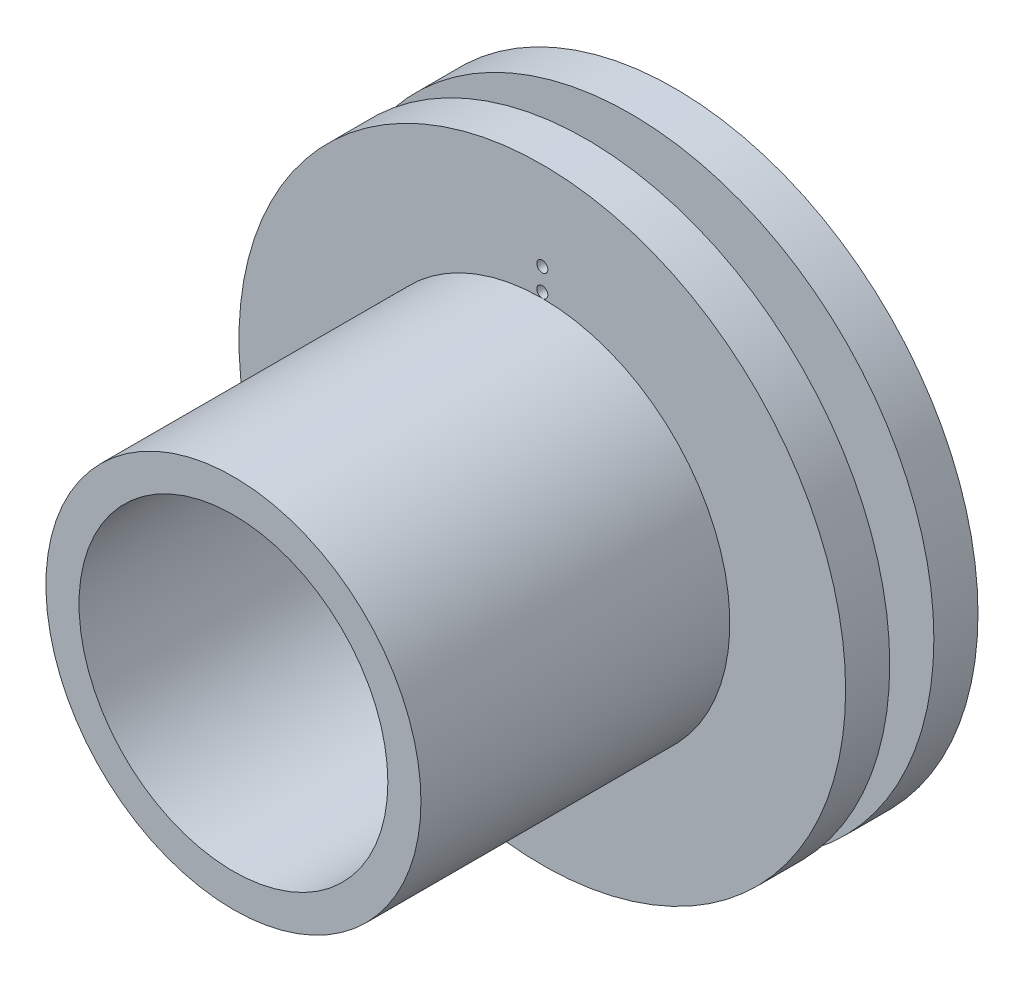
ISO-10303-21;
HEADER;
FILE_DESCRIPTION(('STEP AP214'),'2;1');
FILE_NAME('part.step','',(''),(''),'','','');
FILE_SCHEMA(('AUTOMOTIVE_DESIGN { 1 0 10303 214 1 1 1 1 }'));
ENDSEC;
DATA;
#1=APPLICATION_CONTEXT('core data for automotive mechanical design processes');
#2=APPLICATION_PROTOCOL_DEFINITION('international standard','automotive_design',2000,#1);
#3=PRODUCT_CONTEXT('',#1,'mechanical');
#4=PRODUCT('Part','Part','',(#3));
#5=PRODUCT_RELATED_PRODUCT_CATEGORY('part','',(#4));
#6=PRODUCT_DEFINITION_FORMATION('','',#4);
#7=PRODUCT_DEFINITION_CONTEXT('part definition',#1,'design');
#8=PRODUCT_DEFINITION('design','',#6,#7);
#9=PRODUCT_DEFINITION_SHAPE('','',#8);
#10=(LENGTH_UNIT() NAMED_UNIT(*) SI_UNIT(.MILLI.,.METRE.));
#11=(NAMED_UNIT(*) PLANE_ANGLE_UNIT() SI_UNIT($,.RADIAN.));
#12=(NAMED_UNIT(*) SI_UNIT($,.STERADIAN.) SOLID_ANGLE_UNIT());
#13=UNCERTAINTY_MEASURE_WITH_UNIT(LENGTH_MEASURE(1.E-05),#10,'distance_accuracy_value','');
#14=(GEOMETRIC_REPRESENTATION_CONTEXT(3) GLOBAL_UNCERTAINTY_ASSIGNED_CONTEXT((#13)) GLOBAL_UNIT_ASSIGNED_CONTEXT((#10,
#11,#12)) REPRESENTATION_CONTEXT('',''));
#15=CARTESIAN_POINT('',(0.,0.,0.));
#16=DIRECTION('',(0.,0.,1.));
#17=DIRECTION('',(1.,0.,0.));
#18=AXIS2_PLACEMENT_3D('',#15,#16,#17);
#19=CARTESIAN_POINT('',(0.,0.,6.));
#20=DIRECTION('',(0.,0.,1.));
#21=DIRECTION('',(1.,0.,0.));
#22=AXIS2_PLACEMENT_3D('',#19,#20,#21);
#23=PLANE('',#22);
#24=CARTESIAN_POINT('',(0.,9.75,6.));
#25=DIRECTION('',(0.,0.,1.));
#26=DIRECTION('',(1.,0.,0.));
#27=AXIS2_PLACEMENT_3D('',#24,#25,#26);
#28=CIRCLE('',#27,0.25);
#29=CARTESIAN_POINT('',(0.25,9.75,6.));
#30=VERTEX_POINT('',#29);
#31=EDGE_CURVE('E89',#30,#30,#28,.F.);
#32=ORIENTED_EDGE('',*,*,#31,.T.);
#33=EDGE_LOOP('',(#32));
#34=FACE_BOUND('',#33,.T.);
#35=CARTESIAN_POINT('',(0.,0.,6.));
#36=DIRECTION('',(0.,0.,1.));
#37=DIRECTION('',(1.,0.,0.));
#38=AXIS2_PLACEMENT_3D('',#35,#36,#37);
#39=CIRCLE('',#38,13.75);
#40=CARTESIAN_POINT('',(13.75,0.,6.));
#41=VERTEX_POINT('',#40);
#42=EDGE_CURVE('E101',#41,#41,#39,.T.);
#43=ORIENTED_EDGE('',*,*,#42,.T.);
#44=EDGE_LOOP('',(#43));
#45=FACE_BOUND('',#44,.T.);
#46=CARTESIAN_POINT('',(0.,-9.75,6.));
#47=DIRECTION('',(0.,0.,1.));
#48=DIRECTION('',(1.,0.,0.));
#49=AXIS2_PLACEMENT_3D('',#46,#47,#48);
#50=CIRCLE('',#49,0.25);
#51=CARTESIAN_POINT('',(0.25,-9.75,6.));
#52=VERTEX_POINT('',#51);
#53=EDGE_CURVE('E78',#52,#52,#50,.F.);
#54=ORIENTED_EDGE('',*,*,#53,.T.);
#55=EDGE_LOOP('',(#54));
#56=FACE_BOUND('',#55,.T.);
#57=CARTESIAN_POINT('',(0.,0.,6.));
#58=DIRECTION('',(0.,0.,1.));
#59=DIRECTION('',(1.,0.,0.));
#60=AXIS2_PLACEMENT_3D('',#57,#58,#59);
#61=CIRCLE('',#60,8.5);
#62=CARTESIAN_POINT('',(0.,-8.5,6.));
#63=VERTEX_POINT('',#62);
#64=CARTESIAN_POINT('',(0.,8.5,6.));
#65=VERTEX_POINT('',#64);
#66=EDGE_CURVE('E60',#63,#65,#61,.T.);
#67=ORIENTED_EDGE('',*,*,#66,.F.);
#68=CARTESIAN_POINT('',(0.,-8.75,6.));
#69=DIRECTION('',(0.,0.,1.));
#70=DIRECTION('',(1.,0.,0.));
#71=AXIS2_PLACEMENT_3D('',#68,#69,#70);
#72=CIRCLE('',#71,0.25);
#73=EDGE_CURVE('E51',#63,#63,#72,.F.);
#74=ORIENTED_EDGE('',*,*,#73,.T.);
#75=EDGE_CURVE('E65',#65,#63,#61,.T.);
#76=ORIENTED_EDGE('',*,*,#75,.F.);
#77=CARTESIAN_POINT('',(0.,8.75,6.));
#78=DIRECTION('',(0.,0.,1.));
#79=DIRECTION('',(1.,0.,0.));
#80=AXIS2_PLACEMENT_3D('',#77,#78,#79);
#81=CIRCLE('',#80,0.25);
#82=EDGE_CURVE('E71',#65,#65,#81,.F.);
#83=ORIENTED_EDGE('',*,*,#82,.T.);
#84=EDGE_LOOP('',(#67,#74,#76,#83));
#85=FACE_BOUND('',#84,.T.);
#86=ADVANCED_FACE('F33',(#34,#45,#56,#85),#23,.T.);
#87=CARTESIAN_POINT('',(0.,0.,4.));
#88=DIRECTION('',(0.,0.,1.));
#89=DIRECTION('',(1.,0.,0.));
#90=AXIS2_PLACEMENT_3D('',#87,#88,#89);
#91=PLANE('',#90);
#92=CARTESIAN_POINT('',(0.,9.75,4.));
#93=DIRECTION('',(0.,0.,1.));
#94=DIRECTION('',(1.,0.,0.));
#95=AXIS2_PLACEMENT_3D('',#92,#93,#94);
#96=CIRCLE('',#95,0.25);
#97=CARTESIAN_POINT('',(0.25,9.75,4.));
#98=VERTEX_POINT('',#97);
#99=EDGE_CURVE('E86',#98,#98,#96,.T.);
#100=ORIENTED_EDGE('',*,*,#99,.T.);
#101=EDGE_LOOP('',(#100));
#102=FACE_BOUND('',#101,.T.);
#103=CARTESIAN_POINT('',(0.,0.,4.));
#104=DIRECTION('',(0.,0.,1.));
#105=DIRECTION('',(1.,0.,0.));
#106=AXIS2_PLACEMENT_3D('',#103,#104,#105);
#107=CIRCLE('',#106,13.75);
#108=CARTESIAN_POINT('',(13.75,0.,4.));
#109=VERTEX_POINT('',#108);
#110=EDGE_CURVE('E100',#109,#109,#107,.T.);
#111=ORIENTED_EDGE('',*,*,#110,.F.);
#112=EDGE_LOOP('',(#111));
#113=FACE_BOUND('',#112,.T.);
#114=CARTESIAN_POINT('',(0.,-9.75,4.));
#115=DIRECTION('',(0.,0.,1.));
#116=DIRECTION('',(1.,0.,0.));
#117=AXIS2_PLACEMENT_3D('',#114,#115,#116);
#118=CIRCLE('',#117,0.25);
#119=CARTESIAN_POINT('',(0.25,-9.75,4.));
#120=VERTEX_POINT('',#119);
#121=EDGE_CURVE('E74',#120,#120,#118,.T.);
#122=ORIENTED_EDGE('',*,*,#121,.T.);
#123=EDGE_LOOP('',(#122));
#124=FACE_BOUND('',#123,.T.);
#125=CARTESIAN_POINT('',(0.,0.,4.));
#126=DIRECTION('',(0.,0.,1.));
#127=DIRECTION('',(1.,0.,0.));
#128=AXIS2_PLACEMENT_3D('',#125,#126,#127);
#129=CIRCLE('',#128,8.5);
#130=CARTESIAN_POINT('',(0.,8.5,4.));
#131=VERTEX_POINT('',#130);
#132=CARTESIAN_POINT('',(0.,-8.5,4.));
#133=VERTEX_POINT('',#132);
#134=EDGE_CURVE('E11',#131,#133,#129,.T.);
#135=ORIENTED_EDGE('',*,*,#134,.T.);
#136=CARTESIAN_POINT('',(0.,-8.75,4.));
#137=DIRECTION('',(0.,0.,1.));
#138=DIRECTION('',(1.,0.,0.));
#139=AXIS2_PLACEMENT_3D('',#136,#137,#138);
#140=CIRCLE('',#139,0.25);
#141=EDGE_CURVE('E46',#133,#133,#140,.T.);
#142=ORIENTED_EDGE('',*,*,#141,.T.);
#143=EDGE_CURVE('E41',#133,#131,#129,.T.);
#144=ORIENTED_EDGE('',*,*,#143,.T.);
#145=CARTESIAN_POINT('',(0.,8.75,4.));
#146=DIRECTION('',(0.,0.,1.));
#147=DIRECTION('',(1.,0.,0.));
#148=AXIS2_PLACEMENT_3D('',#145,#146,#147);
#149=CIRCLE('',#148,0.25);
#150=EDGE_CURVE('E75',#131,#131,#149,.T.);
#151=ORIENTED_EDGE('',*,*,#150,.T.);
#152=EDGE_LOOP('',(#135,#142,#144,#151));
#153=FACE_BOUND('',#152,.T.);
#154=ADVANCED_FACE('F120',(#102,#113,#124,#153),#91,.F.);
#155=CARTESIAN_POINT('',(0.,0.,0.));
#156=DIRECTION('',(0.,0.,1.));
#157=DIRECTION('',(1.,0.,0.));
#158=AXIS2_PLACEMENT_3D('',#155,#156,#157);
#159=PLANE('',#158);
#160=CARTESIAN_POINT('',(0.,0.,0.));
#161=DIRECTION('',(0.,0.,1.));
#162=DIRECTION('',(1.,0.,0.));
#163=AXIS2_PLACEMENT_3D('',#160,#161,#162);
#164=CIRCLE('',#163,13.75);
#165=CARTESIAN_POINT('',(13.75,0.,0.));
#166=VERTEX_POINT('',#165);
#167=EDGE_CURVE('E109',#166,#166,#164,.T.);
#168=ORIENTED_EDGE('',*,*,#167,.F.);
#169=EDGE_LOOP('',(#168));
#170=FACE_BOUND('',#169,.T.);
#171=CARTESIAN_POINT('',(0.,0.,0.));
#172=DIRECTION('',(0.,0.,1.));
#173=DIRECTION('',(1.,0.,0.));
#174=AXIS2_PLACEMENT_3D('',#171,#172,#173);
#175=CIRCLE('',#174,7.);
#176=CARTESIAN_POINT('',(7.,0.,0.));
#177=VERTEX_POINT('',#176);
#178=EDGE_CURVE('E96',#177,#177,#175,.T.);
#179=ORIENTED_EDGE('',*,*,#178,.T.);
#180=EDGE_LOOP('',(#179));
#181=FACE_BOUND('',#180,.T.);
#182=ADVANCED_FACE('F116',(#170,#181),#159,.F.);
#183=CARTESIAN_POINT('',(0.,0.,6.));
#184=DIRECTION('',(0.,0.,-1.));
#185=DIRECTION('',(-1.,0.,0.));
#186=AXIS2_PLACEMENT_3D('',#183,#184,#185);
#187=CYLINDRICAL_SURFACE('',#186,8.5);
#188=CARTESIAN_POINT('',(0.,0.,2.));
#189=DIRECTION('',(0.,0.,1.));
#190=DIRECTION('',(1.,0.,0.));
#191=AXIS2_PLACEMENT_3D('',#188,#189,#190);
#192=CIRCLE('',#191,8.5);
#193=CARTESIAN_POINT('',(8.5,0.,2.));
#194=VERTEX_POINT('',#193);
#195=EDGE_CURVE('E104',#194,#194,#192,.F.);
#196=ORIENTED_EDGE('',*,*,#195,.F.);
#197=EDGE_LOOP('',(#196));
#198=FACE_BOUND('',#197,.T.);
#199=ORIENTED_EDGE('',*,*,#134,.F.);
#200=ORIENTED_EDGE('',*,*,#143,.F.);
#201=EDGE_LOOP('',(#199,#200));
#202=FACE_BOUND('',#201,.T.);
#203=ADVANCED_FACE('F119',(#198,#202),#187,.T.);
#204=CARTESIAN_POINT('',(0.,0.,2.));
#205=DIRECTION('',(0.,0.,1.));
#206=DIRECTION('',(1.,0.,0.));
#207=AXIS2_PLACEMENT_3D('',#204,#205,#206);
#208=PLANE('',#207);
#209=CARTESIAN_POINT('',(0.,0.,2.));
#210=DIRECTION('',(0.,0.,1.));
#211=DIRECTION('',(1.,0.,0.));
#212=AXIS2_PLACEMENT_3D('',#209,#210,#211);
#213=CIRCLE('',#212,13.75);
#214=CARTESIAN_POINT('',(13.75,0.,2.));
#215=VERTEX_POINT('',#214);
#216=EDGE_CURVE('E110',#215,#215,#213,.T.);
#217=ORIENTED_EDGE('',*,*,#216,.T.);
#218=EDGE_LOOP('',(#217));
#219=FACE_BOUND('',#218,.T.);
#220=ORIENTED_EDGE('',*,*,#195,.T.);
#221=EDGE_LOOP('',(#220));
#222=FACE_BOUND('',#221,.T.);
#223=ADVANCED_FACE('F153',(#219,#222),#208,.T.);
#224=CARTESIAN_POINT('',(0.,0.,2.));
#225=DIRECTION('',(0.,0.,-1.));
#226=DIRECTION('',(-1.,0.,0.));
#227=AXIS2_PLACEMENT_3D('',#224,#225,#226);
#228=CYLINDRICAL_SURFACE('',#227,13.75);
#229=ORIENTED_EDGE('',*,*,#216,.F.);
#230=EDGE_LOOP('',(#229));
#231=FACE_BOUND('',#230,.T.);
#232=ORIENTED_EDGE('',*,*,#167,.T.);
#233=EDGE_LOOP('',(#232));
#234=FACE_BOUND('',#233,.T.);
#235=ADVANCED_FACE('F35',(#231,#234),#228,.T.);
#236=CARTESIAN_POINT('',(0.,0.,6.));
#237=DIRECTION('',(0.,0.,-1.));
#238=DIRECTION('',(-1.,0.,0.));
#239=AXIS2_PLACEMENT_3D('',#236,#237,#238);
#240=CYLINDRICAL_SURFACE('',#239,13.75);
#241=ORIENTED_EDGE('',*,*,#42,.F.);
#242=EDGE_LOOP('',(#241));
#243=FACE_BOUND('',#242,.T.);
#244=ORIENTED_EDGE('',*,*,#110,.T.);
#245=EDGE_LOOP('',(#244));
#246=FACE_BOUND('',#245,.T.);
#247=ADVANCED_FACE('F127',(#243,#246),#240,.T.);
#248=CARTESIAN_POINT('',(0.,0.,6.));
#249=DIRECTION('',(0.,0.,-1.));
#250=DIRECTION('',(-1.,0.,0.));
#251=AXIS2_PLACEMENT_3D('',#248,#249,#250);
#252=CYLINDRICAL_SURFACE('',#251,7.);
#253=ORIENTED_EDGE('',*,*,#178,.F.);
#254=EDGE_LOOP('',(#253));
#255=FACE_BOUND('',#254,.T.);
#256=CARTESIAN_POINT('',(0.,0.,20.));
#257=DIRECTION('',(0.,0.,1.));
#258=DIRECTION('',(1.,0.,0.));
#259=AXIS2_PLACEMENT_3D('',#256,#257,#258);
#260=CIRCLE('',#259,7.);
#261=CARTESIAN_POINT('',(7.,0.,20.));
#262=VERTEX_POINT('',#261);
#263=EDGE_CURVE('E68',#262,#262,#260,.T.);
#264=ORIENTED_EDGE('',*,*,#263,.T.);
#265=EDGE_LOOP('',(#264));
#266=FACE_BOUND('',#265,.T.);
#267=ADVANCED_FACE('F123',(#255,#266),#252,.F.);
#268=CARTESIAN_POINT('',(0.,0.,20.));
#269=DIRECTION('',(0.,0.,1.));
#270=DIRECTION('',(1.,0.,0.));
#271=AXIS2_PLACEMENT_3D('',#268,#269,#270);
#272=PLANE('',#271);
#273=CARTESIAN_POINT('',(0.,0.,20.));
#274=DIRECTION('',(0.,0.,1.));
#275=DIRECTION('',(1.,0.,0.));
#276=AXIS2_PLACEMENT_3D('',#273,#274,#275);
#277=CIRCLE('',#276,8.5);
#278=CARTESIAN_POINT('',(8.5,0.,20.));
#279=VERTEX_POINT('',#278);
#280=EDGE_CURVE('E94',#279,#279,#277,.T.);
#281=ORIENTED_EDGE('',*,*,#280,.T.);
#282=EDGE_LOOP('',(#281));
#283=FACE_BOUND('',#282,.T.);
#284=ORIENTED_EDGE('',*,*,#263,.F.);
#285=EDGE_LOOP('',(#284));
#286=FACE_BOUND('',#285,.T.);
#287=ADVANCED_FACE('F126',(#283,#286),#272,.T.);
#288=CARTESIAN_POINT('',(0.,0.,20.));
#289=DIRECTION('',(0.,0.,-1.));
#290=DIRECTION('',(-1.,0.,0.));
#291=AXIS2_PLACEMENT_3D('',#288,#289,#290);
#292=CYLINDRICAL_SURFACE('',#291,8.5);
#293=ORIENTED_EDGE('',*,*,#75,.T.);
#294=ORIENTED_EDGE('',*,*,#66,.T.);
#295=EDGE_LOOP('',(#293,#294));
#296=FACE_BOUND('',#295,.T.);
#297=ORIENTED_EDGE('',*,*,#280,.F.);
#298=EDGE_LOOP('',(#297));
#299=FACE_BOUND('',#298,.T.);
#300=ADVANCED_FACE('F62',(#296,#299),#292,.T.);
#301=CARTESIAN_POINT('',(0.,9.75,20.));
#302=DIRECTION('',(0.,0.,-1.));
#303=DIRECTION('',(-1.,0.,0.));
#304=AXIS2_PLACEMENT_3D('',#301,#302,#303);
#305=CYLINDRICAL_SURFACE('',#304,0.25);
#306=ORIENTED_EDGE('',*,*,#31,.F.);
#307=EDGE_LOOP('',(#306));
#308=FACE_BOUND('',#307,.T.);
#309=ORIENTED_EDGE('',*,*,#99,.F.);
#310=EDGE_LOOP('',(#309));
#311=FACE_BOUND('',#310,.T.);
#312=ADVANCED_FACE('F137',(#308,#311),#305,.F.);
#313=CARTESIAN_POINT('',(0.,-9.75,20.));
#314=DIRECTION('',(0.,0.,-1.));
#315=DIRECTION('',(-1.,0.,0.));
#316=AXIS2_PLACEMENT_3D('',#313,#314,#315);
#317=CYLINDRICAL_SURFACE('',#316,0.25);
#318=ORIENTED_EDGE('',*,*,#53,.F.);
#319=EDGE_LOOP('',(#318));
#320=FACE_BOUND('',#319,.T.);
#321=ORIENTED_EDGE('',*,*,#121,.F.);
#322=EDGE_LOOP('',(#321));
#323=FACE_BOUND('',#322,.T.);
#324=ADVANCED_FACE('F171',(#320,#323),#317,.F.);
#325=CARTESIAN_POINT('',(0.,8.75,20.));
#326=DIRECTION('',(0.,0.,-1.));
#327=DIRECTION('',(-1.,0.,0.));
#328=AXIS2_PLACEMENT_3D('',#325,#326,#327);
#329=CYLINDRICAL_SURFACE('',#328,0.25);
#330=ORIENTED_EDGE('',*,*,#82,.F.);
#331=EDGE_LOOP('',(#330));
#332=FACE_BOUND('',#331,.T.);
#333=ORIENTED_EDGE('',*,*,#150,.F.);
#334=EDGE_LOOP('',(#333));
#335=FACE_BOUND('',#334,.T.);
#336=ADVANCED_FACE('F72',(#332,#335),#329,.F.);
#337=CARTESIAN_POINT('',(0.,-8.75,20.));
#338=DIRECTION('',(0.,0.,-1.));
#339=DIRECTION('',(-1.,0.,0.));
#340=AXIS2_PLACEMENT_3D('',#337,#338,#339);
#341=CYLINDRICAL_SURFACE('',#340,0.25);
#342=ORIENTED_EDGE('',*,*,#73,.F.);
#343=EDGE_LOOP('',(#342));
#344=FACE_BOUND('',#343,.T.);
#345=ORIENTED_EDGE('',*,*,#141,.F.);
#346=EDGE_LOOP('',(#345));
#347=FACE_BOUND('',#346,.T.);
#348=ADVANCED_FACE('F170',(#344,#347),#341,.F.);
#349=CLOSED_SHELL('',(#86,#154,#182,#203,#223,#235,#247,#267,#287,#300,#312,#324,#336,#348));
#350=MANIFOLD_SOLID_BREP('B2',#349);
#351=ADVANCED_BREP_SHAPE_REPRESENTATION('',(#18,#350),#14);
#352=SHAPE_DEFINITION_REPRESENTATION(#9,#351);
ENDSEC;
END-ISO-10303-21;
